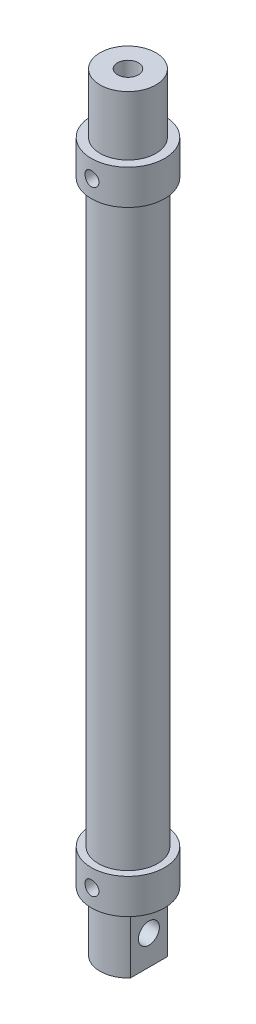
ISO-10303-21;
HEADER;
FILE_DESCRIPTION(('STEP AP214'),'2;1');
FILE_NAME('part.step','',(''),(''),'','','');
FILE_SCHEMA(('AUTOMOTIVE_DESIGN { 1 0 10303 214 1 1 1 1 }'));
ENDSEC;
DATA;
#1=APPLICATION_CONTEXT('core data for automotive mechanical design processes');
#2=APPLICATION_PROTOCOL_DEFINITION('international standard','automotive_design',2000,#1);
#3=PRODUCT_CONTEXT('',#1,'mechanical');
#4=PRODUCT('Part','Part','',(#3));
#5=PRODUCT_RELATED_PRODUCT_CATEGORY('part','',(#4));
#6=PRODUCT_DEFINITION_FORMATION('','',#4);
#7=PRODUCT_DEFINITION_CONTEXT('part definition',#1,'design');
#8=PRODUCT_DEFINITION('design','',#6,#7);
#9=PRODUCT_DEFINITION_SHAPE('','',#8);
#10=(LENGTH_UNIT() NAMED_UNIT(*) SI_UNIT(.MILLI.,.METRE.));
#11=(NAMED_UNIT(*) PLANE_ANGLE_UNIT() SI_UNIT($,.RADIAN.));
#12=(NAMED_UNIT(*) SI_UNIT($,.STERADIAN.) SOLID_ANGLE_UNIT());
#13=UNCERTAINTY_MEASURE_WITH_UNIT(LENGTH_MEASURE(1.E-05),#10,'distance_accuracy_value','');
#14=(GEOMETRIC_REPRESENTATION_CONTEXT(3) GLOBAL_UNCERTAINTY_ASSIGNED_CONTEXT((#13)) GLOBAL_UNIT_ASSIGNED_CONTEXT((#10,
#11,#12)) REPRESENTATION_CONTEXT('',''));
#15=CARTESIAN_POINT('',(0.,0.,0.));
#16=DIRECTION('',(0.,0.,1.));
#17=DIRECTION('',(1.,0.,0.));
#18=AXIS2_PLACEMENT_3D('',#15,#16,#17);
#19=CARTESIAN_POINT('',(0.,220.,0.));
#20=DIRECTION('',(0.,-1.,0.));
#21=DIRECTION('',(0.,0.,-1.));
#22=AXIS2_PLACEMENT_3D('',#19,#20,#21);
#23=CYLINDRICAL_SURFACE('',#22,8.);
#24=CARTESIAN_POINT('',(0.,220.,0.));
#25=DIRECTION('',(0.,1.,0.));
#26=DIRECTION('',(0.,0.,1.));
#27=AXIS2_PLACEMENT_3D('',#24,#25,#26);
#28=CIRCLE('',#27,8.);
#29=CARTESIAN_POINT('',(0.,220.,8.));
#30=VERTEX_POINT('',#29);
#31=EDGE_CURVE('E11',#30,#30,#28,.T.);
#32=ORIENTED_EDGE('',*,*,#31,.F.);
#33=EDGE_LOOP('',(#32));
#34=FACE_BOUND('',#33,.T.);
#35=CARTESIAN_POINT('',(0.,203.,0.));
#36=DIRECTION('',(0.,1.,0.));
#37=DIRECTION('',(0.,0.,1.));
#38=AXIS2_PLACEMENT_3D('',#35,#36,#37);
#39=CIRCLE('',#38,8.);
#40=CARTESIAN_POINT('',(0.,203.,8.));
#41=VERTEX_POINT('',#40);
#42=EDGE_CURVE('E52',#41,#41,#39,.T.);
#43=ORIENTED_EDGE('',*,*,#42,.T.);
#44=EDGE_LOOP('',(#43));
#45=FACE_BOUND('',#44,.T.);
#46=ADVANCED_FACE('F45',(#34,#45),#23,.T.);
#47=CARTESIAN_POINT('',(0.,220.,0.));
#48=DIRECTION('',(0.,1.,0.));
#49=DIRECTION('',(0.,0.,1.));
#50=AXIS2_PLACEMENT_3D('',#47,#48,#49);
#51=PLANE('',#50);
#52=CARTESIAN_POINT('',(0.,220.,0.));
#53=DIRECTION('',(0.,1.,0.));
#54=DIRECTION('',(0.,0.,1.));
#55=AXIS2_PLACEMENT_3D('',#52,#53,#54);
#56=CIRCLE('',#55,3.);
#57=CARTESIAN_POINT('',(0.,220.,3.));
#58=VERTEX_POINT('',#57);
#59=EDGE_CURVE('E58',#58,#58,#56,.T.);
#60=ORIENTED_EDGE('',*,*,#59,.F.);
#61=EDGE_LOOP('',(#60));
#62=FACE_BOUND('',#61,.T.);
#63=ORIENTED_EDGE('',*,*,#31,.T.);
#64=EDGE_LOOP('',(#63));
#65=FACE_BOUND('',#64,.T.);
#66=ADVANCED_FACE('F74',(#62,#65),#51,.T.);
#67=CARTESIAN_POINT('',(0.,203.,0.));
#68=DIRECTION('',(0.,1.,0.));
#69=DIRECTION('',(0.,0.,1.));
#70=AXIS2_PLACEMENT_3D('',#67,#68,#69);
#71=PLANE('',#70);
#72=CARTESIAN_POINT('',(0.,203.,0.));
#73=DIRECTION('',(0.,1.,0.));
#74=DIRECTION('',(0.,0.,1.));
#75=AXIS2_PLACEMENT_3D('',#72,#73,#74);
#76=CIRCLE('',#75,3.);
#77=CARTESIAN_POINT('',(0.,203.,3.));
#78=VERTEX_POINT('',#77);
#79=EDGE_CURVE('E48',#78,#78,#76,.T.);
#80=ORIENTED_EDGE('',*,*,#79,.T.);
#81=EDGE_LOOP('',(#80));
#82=FACE_BOUND('',#81,.T.);
#83=ORIENTED_EDGE('',*,*,#42,.F.);
#84=EDGE_LOOP('',(#83));
#85=FACE_BOUND('',#84,.T.);
#86=ADVANCED_FACE('F65',(#82,#85),#71,.F.);
#87=CARTESIAN_POINT('',(0.,94.,0.));
#88=DIRECTION('',(0.,1.,0.));
#89=DIRECTION('',(0.,0.,1.));
#90=AXIS2_PLACEMENT_3D('',#87,#88,#89);
#91=CYLINDRICAL_SURFACE('',#90,3.);
#92=ORIENTED_EDGE('',*,*,#59,.T.);
#93=EDGE_LOOP('',(#92));
#94=FACE_BOUND('',#93,.T.);
#95=ORIENTED_EDGE('',*,*,#79,.F.);
#96=EDGE_LOOP('',(#95));
#97=FACE_BOUND('',#96,.T.);
#98=ADVANCED_FACE('F68',(#94,#97),#91,.F.);
#99=CLOSED_SHELL('',(#46,#66,#86,#98));
#100=MANIFOLD_SOLID_BREP('B2',#99);
#101=CARTESIAN_POINT('',(0.,203.,0.));
#102=DIRECTION('',(0.,-1.,0.));
#103=DIRECTION('',(0.,0.,-1.));
#104=AXIS2_PLACEMENT_3D('',#101,#102,#103);
#105=CYLINDRICAL_SURFACE('',#104,10.5);
#106=CARTESIAN_POINT('',(0.,203.,0.));
#107=DIRECTION('',(0.,1.,0.));
#108=DIRECTION('',(0.,0.,1.));
#109=AXIS2_PLACEMENT_3D('',#106,#107,#108);
#110=CIRCLE('',#109,10.5);
#111=CARTESIAN_POINT('',(0.,203.,10.5));
#112=VERTEX_POINT('',#111);
#113=EDGE_CURVE('E44',#112,#112,#110,.T.);
#114=ORIENTED_EDGE('',*,*,#113,.F.);
#115=EDGE_LOOP('',(#114));
#116=FACE_BOUND('',#115,.T.);
#117=CARTESIAN_POINT('',(0.,193.,0.));
#118=DIRECTION('',(0.,1.,0.));
#119=DIRECTION('',(0.,0.,1.));
#120=AXIS2_PLACEMENT_3D('',#117,#118,#119);
#121=CIRCLE('',#120,10.5);
#122=CARTESIAN_POINT('',(0.,193.,10.5));
#123=VERTEX_POINT('',#122);
#124=EDGE_CURVE('E127',#123,#123,#121,.T.);
#125=ORIENTED_EDGE('',*,*,#124,.T.);
#126=EDGE_LOOP('',(#125));
#127=FACE_BOUND('',#126,.T.);
#128=CARTESIAN_POINT('',(-2.,198.,10.3077640640442));
#129=CARTESIAN_POINT('',(-1.99999576747856,197.888757965715,10.3077662331161));
#130=CARTESIAN_POINT('',(-1.99068741084944,197.777461397596,10.3095844213753));
#131=CARTESIAN_POINT('',(-1.95372640408913,197.558008931146,10.3166512903101));
#132=CARTESIAN_POINT('',(-1.92605839800911,197.449855741032,10.3219028425853));
#133=CARTESIAN_POINT('',(-1.85326060026377,197.239896982716,10.3352205759115));
#134=CARTESIAN_POINT('',(-1.80814733034197,197.138085514121,10.3432840931504));
#135=CARTESIAN_POINT('',(-1.70178371624362,196.943481779794,10.3613140447469));
#136=CARTESIAN_POINT('',(-1.64053454751282,196.850688857764,10.3712803404791));
#137=CARTESIAN_POINT('',(-1.50279954107445,196.675558444085,10.3921358315924));
#138=CARTESIAN_POINT('',(-1.42614646664806,196.593353566668,10.4030343280567));
#139=CARTESIAN_POINT('',(-1.26014096103138,196.442888707737,10.4244441525531));
#140=CARTESIAN_POINT('',(-1.17078768389029,196.374629655882,10.4349554547355));
#141=CARTESIAN_POINT('',(-0.981045466793095,196.253484397504,10.4545063484475));
#142=CARTESIAN_POINT('',(-0.880575179073281,196.200723456598,10.4635337012442));
#143=CARTESIAN_POINT('',(-0.671995748816191,196.112879452154,10.4789953609074));
#144=CARTESIAN_POINT('',(-0.563887255355314,196.077794888575,10.4854298877952));
#145=CARTESIAN_POINT('',(-0.344474928084999,196.026710279054,10.4949152003273));
#146=CARTESIAN_POINT('',(-0.233224906241214,196.010486585448,10.4980056086445));
#147=CARTESIAN_POINT('',(-0.00954197299762268,195.996887180764,10.5005911121681));
#148=CARTESIAN_POINT('',(0.102890833726011,195.999509815571,10.5000865229021));
#149=CARTESIAN_POINT('',(0.324213319087042,196.023357538852,10.4955697879858));
#150=CARTESIAN_POINT('',(0.433130008737623,196.044341793068,10.4916030541438));
#151=CARTESIAN_POINT('',(0.645867459868364,196.103935934641,10.4806587329107));
#152=CARTESIAN_POINT('',(0.749688031123391,196.142546479389,10.4736810332228));
#153=CARTESIAN_POINT('',(0.949982043237772,196.236525178388,10.4574231445239));
#154=CARTESIAN_POINT('',(1.04640941469807,196.291989158331,10.4481298452825));
#155=CARTESIAN_POINT('',(1.22867819746183,196.418029632365,10.4282677453701));
#156=CARTESIAN_POINT('',(1.31451849765684,196.48860771055,10.4176988110517));
#157=CARTESIAN_POINT('',(1.47460391847544,196.644198683397,10.3962580003512));
#158=CARTESIAN_POINT('',(1.548644094618,196.729422294666,10.385383976594));
#159=CARTESIAN_POINT('',(1.68141214001886,196.911184410209,10.3647181130096));
#160=CARTESIAN_POINT('',(1.74013977079182,197.007723090675,10.3549262900386));
#161=CARTESIAN_POINT('',(1.84067693368896,197.209651945166,10.3375301079842));
#162=CARTESIAN_POINT('',(1.88245589383698,197.315057703903,10.3299297088641));
#163=CARTESIAN_POINT('',(1.94765282338577,197.531570190026,10.3178369316443));
#164=CARTESIAN_POINT('',(1.97107294526376,197.642676247452,10.3133441891954));
#165=CARTESIAN_POINT('',(1.9985865151718,197.86558516725,10.3080477071057));
#166=CARTESIAN_POINT('',(2.0029747581422,197.977350344609,10.3071877035286));
#167=CARTESIAN_POINT('',(1.99309094275412,198.200016265089,10.3091034020993));
#168=CARTESIAN_POINT('',(1.97881983846034,198.310917052117,10.3118789183607));
#169=CARTESIAN_POINT('',(1.93227575814481,198.527731922876,10.3207004508845));
#170=CARTESIAN_POINT('',(1.90015801454271,198.633680582036,10.3267182518009));
#171=CARTESIAN_POINT('',(1.81899736459844,198.838692762659,10.3413218894342));
#172=CARTESIAN_POINT('',(1.76995317622344,198.93775576191,10.349907920666));
#173=CARTESIAN_POINT('',(1.65565593283059,199.127481258731,10.3688083137884));
#174=CARTESIAN_POINT('',(1.59021706249931,199.218029851452,10.3791420142757));
#175=CARTESIAN_POINT('',(1.44523791801399,199.386967857122,10.4003193132972));
#176=CARTESIAN_POINT('',(1.36569633350554,199.465356138926,10.4111629591442));
#177=CARTESIAN_POINT('',(1.19345143615016,199.608853516365,10.4323195643359));
#178=CARTESIAN_POINT('',(1.10058140595695,199.673764102217,10.4426231174714));
#179=CARTESIAN_POINT('',(0.905083177029172,199.787060883346,10.4613791209831));
#180=CARTESIAN_POINT('',(0.80245536248802,199.835447728867,10.4698316441966));
#181=CARTESIAN_POINT('',(0.590897063083826,199.914028154784,10.4838928326543));
#182=CARTESIAN_POINT('',(0.482003476197483,199.944318260011,10.4895165603032));
#183=CARTESIAN_POINT('',(0.260557092128003,199.986152933502,10.4973508525688));
#184=CARTESIAN_POINT('',(0.1480046942225,199.997699540242,10.4995617883475));
#185=CARTESIAN_POINT('',(-0.075662434707431,200.001646620402,10.5003136791865));
#186=CARTESIAN_POINT('',(-0.186771797894084,199.994346590725,10.4989120431795));
#187=CARTESIAN_POINT('',(-0.406149933837082,199.961464807718,10.4927159027535));
#188=CARTESIAN_POINT('',(-0.514418735713435,199.935883241875,10.4879214331301));
#189=CARTESIAN_POINT('',(-0.724877493923957,199.867292390599,10.4754786931883));
#190=CARTESIAN_POINT('',(-0.827078490952685,199.824315944648,10.467835802495));
#191=CARTESIAN_POINT('',(-1.02286315652585,199.722191619318,10.4505225438582));
#192=CARTESIAN_POINT('',(-1.11644622254048,199.663042610369,10.4408520343067));
#193=CARTESIAN_POINT('',(-1.29382831156942,199.529226067606,10.4203698549555));
#194=CARTESIAN_POINT('',(-1.3774627863143,199.4543426431,10.4095434656168));
#195=CARTESIAN_POINT('',(-1.53108232354618,199.291629924921,10.3880613328083));
#196=CARTESIAN_POINT('',(-1.6010641667755,199.203797586476,10.3774056301285));
#197=CARTESIAN_POINT('',(-1.72602479696763,199.01667088302,10.3573593703099));
#198=CARTESIAN_POINT('',(-1.78085311729889,198.917274584498,10.3479819394977));
#199=CARTESIAN_POINT('',(-1.87294496084188,198.710533647281,10.3317124385101));
#200=CARTESIAN_POINT('',(-1.91022491447504,198.603196552924,10.3248180449097));
#201=CARTESIAN_POINT('',(-1.95866569612498,198.412966141594,10.3157185929825));
#202=CARTESIAN_POINT('',(-1.97413922525693,198.331180099667,10.312753537306));
#203=CARTESIAN_POINT('',(-1.99480781101632,198.16627283608,10.3087754902806));
#204=CARTESIAN_POINT('',(-2.00000316374252,198.083151652952,10.3077624426974));
#205=CARTESIAN_POINT('',(-2.,198.,10.3077640640442));
#206=B_SPLINE_CURVE_WITH_KNOTS('',3,(#128,#129,#130,#131,#132,#133,#134,#135,#136,#137,#138,
#139,#140,#141,#142,#143,#144,#145,#146,#147,#148,#149,#150,#151,#152,#153,#154,#155,#156,#157,
#158,#159,#160,#161,#162,#163,#164,#165,#166,#167,#168,#169,#170,#171,#172,#173,#174,#175,#176,
#177,#178,#179,#180,#181,#182,#183,#184,#185,#186,#187,#188,#189,#190,#191,#192,#193,#194,#195,
#196,#197,#198,#199,#200,#201,#202,#203,#204,#205),.UNSPECIFIED.,.T.,.F.,(4,2,2,2,2,2,2,2,2,2,2,
2,2,2,2,2,2,2,2,2,2,2,2,2,2,2,2,2,2,2,2,2,2,2,2,2,2,2,4),(0.,0.333421770793022,
0.667122766528012,1.00050849774322,1.33386994964594,1.67106783624807,2.00828819387893,
2.34816357408135,2.68801010714636,3.02378433813051,3.35952909906649,3.69093508873408,
4.02235343955144,4.35569260286979,4.68906672027079,5.02771540514515,5.36636936399093,
5.70563149865266,6.04485385066211,6.37880260457196,6.71273428413008,7.04380584853122,
7.37490249426554,7.70993643750709,8.04500152677398,8.38469764647552,8.72438039685045,
9.06223477768129,9.40005241219934,9.73253485751047,10.0650138930459,10.3968681534587,
10.7287455981505,11.0655148874687,11.4023634904492,11.7424455878908,12.0822086321944,
12.3314432878497,12.580670763326),.UNSPECIFIED.);
#207=CARTESIAN_POINT('',(-2.,198.,10.3077640640442));
#208=VERTEX_POINT('',#207);
#209=EDGE_CURVE('E138',#208,#208,#206,.T.);
#210=ORIENTED_EDGE('',*,*,#209,.F.);
#211=EDGE_LOOP('',(#210));
#212=FACE_BOUND('',#211,.T.);
#213=ADVANCED_FACE('F114',(#116,#127,#212),#105,.T.);
#214=CARTESIAN_POINT('',(0.,94.,0.));
#215=DIRECTION('',(0.,1.,0.));
#216=DIRECTION('',(0.,0.,1.));
#217=AXIS2_PLACEMENT_3D('',#214,#215,#216);
#218=CYLINDRICAL_SURFACE('',#217,3.);
#219=CARTESIAN_POINT('',(0.,203.,0.));
#220=DIRECTION('',(0.,1.,0.));
#221=DIRECTION('',(0.,0.,1.));
#222=AXIS2_PLACEMENT_3D('',#219,#220,#221);
#223=CIRCLE('',#222,3.);
#224=CARTESIAN_POINT('',(0.,203.,3.));
#225=VERTEX_POINT('',#224);
#226=EDGE_CURVE('E132',#225,#225,#223,.T.);
#227=ORIENTED_EDGE('',*,*,#226,.T.);
#228=EDGE_LOOP('',(#227));
#229=FACE_BOUND('',#228,.T.);
#230=CARTESIAN_POINT('',(0.,193.,0.));
#231=DIRECTION('',(0.,1.,0.));
#232=DIRECTION('',(0.,0.,1.));
#233=AXIS2_PLACEMENT_3D('',#230,#231,#232);
#234=CIRCLE('',#233,3.);
#235=CARTESIAN_POINT('',(0.,193.,3.));
#236=VERTEX_POINT('',#235);
#237=EDGE_CURVE('E136',#236,#236,#234,.T.);
#238=ORIENTED_EDGE('',*,*,#237,.F.);
#239=EDGE_LOOP('',(#238));
#240=FACE_BOUND('',#239,.T.);
#241=CARTESIAN_POINT('',(0.,196.,3.));
#242=CARTESIAN_POINT('',(-0.100484716668078,195.999999450368,3.0000004164484));
#243=CARTESIAN_POINT('',(-0.200969087132901,196.007613969956,2.99490802753388));
#244=CARTESIAN_POINT('',(-0.398733058031679,196.037596864106,2.97504652423809));
#245=CARTESIAN_POINT('',(-0.496011113955005,196.059972243123,2.96027281581235));
#246=CARTESIAN_POINT('',(-0.68421230785425,196.118107717325,2.92250482404708));
#247=CARTESIAN_POINT('',(-0.775162872657558,196.153805140008,2.89954905493315));
#248=CARTESIAN_POINT('',(-0.949415290997261,196.237063363272,2.8472613787744));
#249=CARTESIAN_POINT('',(-1.03271603160966,196.284625886301,2.8179285460551));
#250=CARTESIAN_POINT('',(-1.1972847007701,196.394656937367,2.75227329369839));
#251=CARTESIAN_POINT('',(-1.27778030546067,196.458047860743,2.7155689757932));
#252=CARTESIAN_POINT('',(-1.42772804469273,196.595730048658,2.63982313083466));
#253=CARTESIAN_POINT('',(-1.49716405543887,196.670036929838,2.60077830356833));
#254=CARTESIAN_POINT('',(-1.63422297745495,196.841052367613,2.51728264678794));
#255=CARTESIAN_POINT('',(-1.6998318636275,196.939445653203,2.47295067937795));
#256=CARTESIAN_POINT('',(-1.81350357014175,197.148363377647,2.3908414735282));
#257=CARTESIAN_POINT('',(-1.86159673426503,197.258866401563,2.35305295954668));
#258=CARTESIAN_POINT('',(-1.92674035011438,197.456711293422,2.2997626664146));
#259=CARTESIAN_POINT('',(-1.94874447236008,197.541528452874,2.28097627892403));
#260=CARTESIAN_POINT('',(-1.98150617785229,197.714744504742,2.25257969659604));
#261=CARTESIAN_POINT('',(-1.99228314651963,197.803136948726,2.24295368744147));
#262=CARTESIAN_POINT('',(-2.00191364141227,197.981474778856,2.23436605608045));
#263=CARTESIAN_POINT('',(-2.00071842917523,198.071425023452,2.23544802558503));
#264=CARTESIAN_POINT('',(-1.98637581333355,198.2496349735,2.24819775483426));
#265=CARTESIAN_POINT('',(-1.97321828380392,198.337893182028,2.25987448286882));
#266=CARTESIAN_POINT('',(-1.93664994217324,198.506467051242,2.29127185989961));
#267=CARTESIAN_POINT('',(-1.91371711479475,198.586961335939,2.31061488324376));
#268=CARTESIAN_POINT('',(-1.85870118583422,198.743023690976,2.35509622933625));
#269=CARTESIAN_POINT('',(-1.82661507328549,198.818590130239,2.38023645854891));
#270=CARTESIAN_POINT('',(-1.74673818732646,198.979025395357,2.43964196377949));
#271=CARTESIAN_POINT('',(-1.69708052300442,199.062659900483,2.47472317740629));
#272=CARTESIAN_POINT('',(-1.58668960438217,199.221383395286,2.5469153773344));
#273=CARTESIAN_POINT('',(-1.5259426899961,199.296461657762,2.5840288270933));
#274=CARTESIAN_POINT('',(-1.37981165322305,199.452542545603,2.66543343763726));
#275=CARTESIAN_POINT('',(-1.29193938283652,199.531334048683,2.70954744720562));
#276=CARTESIAN_POINT('',(-1.10200799908003,199.673196494539,2.79218100665214));
#277=CARTESIAN_POINT('',(-0.99996229934364,199.736282145409,2.83070577648044));
#278=CARTESIAN_POINT('',(-0.804857827096472,199.833477718623,2.89145404090366));
#279=CARTESIAN_POINT('',(-0.713957643371856,199.870843363339,2.91539261165541));
#280=CARTESIAN_POINT('',(-0.526036043935431,199.932104925625,2.95507719030499));
#281=CARTESIAN_POINT('',(-0.429019879001602,199.956012227132,2.97083012127544));
#282=CARTESIAN_POINT('',(-0.230985453172235,199.989161165238,2.99275882156808));
#283=CARTESIAN_POINT('',(-0.129951811934114,199.998339460938,2.99889322461187));
#284=CARTESIAN_POINT('',(0.0724415193893884,200.001247088562,3.00083114965147));
#285=CARTESIAN_POINT('',(0.173801186186666,199.994977500489,2.99663539385634));
#286=CARTESIAN_POINT('',(0.366455717204277,199.968375944438,2.97899589424272));
#287=CARTESIAN_POINT('',(0.457957444679229,199.949062702245,2.96622246390225));
#288=CARTESIAN_POINT('',(0.636116392427435,199.898404313987,2.93318449284836));
#289=CARTESIAN_POINT('',(0.722772837571169,199.867057249072,2.91291875746988));
#290=CARTESIAN_POINT('',(0.89466475046603,199.791347702955,2.86496352529157));
#291=CARTESIAN_POINT('',(0.979496184631449,199.746311845918,2.83689870135784));
#292=CARTESIAN_POINT('',(1.14068302395732,199.645566710054,2.7760185561151));
#293=CARTESIAN_POINT('',(1.21703314820093,199.589850839468,2.7432003040394));
#294=CARTESIAN_POINT('',(1.37185445482327,199.459392131842,2.66954546653429));
#295=CARTESIAN_POINT('',(1.44875187569568,199.383033739925,2.62826156800163));
#296=CARTESIAN_POINT('',(1.58933968069452,199.218888570043,2.54571173085955));
#297=CARTESIAN_POINT('',(1.65302093657233,199.131093960892,2.50444582417843));
#298=CARTESIAN_POINT('',(1.76124776549316,198.952857587232,2.42939678970577));
#299=CARTESIAN_POINT('',(1.80695636125286,198.863267966538,2.39527597025699));
#300=CARTESIAN_POINT('',(1.88496213740267,198.676127347556,2.33438974266152));
#301=CARTESIAN_POINT('',(1.91728345682192,198.578591061695,2.3076111252982));
#302=CARTESIAN_POINT('',(1.96235843465341,198.395435512805,2.26933208182631));
#303=CARTESIAN_POINT('',(1.97758597566227,198.310828190124,2.25594998021256));
#304=CARTESIAN_POINT('',(1.99699205923373,198.139426718682,2.23879466438397));
#305=CARTESIAN_POINT('',(2.00118260285317,198.05263504886,2.23501101347816));
#306=CARTESIAN_POINT('',(1.99823921981266,197.879356943276,2.23764201149982));
#307=CARTESIAN_POINT('',(1.99109858767783,197.792870718626,2.24406269907464));
#308=CARTESIAN_POINT('',(1.96596997224745,197.622656471468,2.26610452403492));
#309=CARTESIAN_POINT('',(1.94796751728257,197.538932286176,2.28173793527616));
#310=CARTESIAN_POINT('',(1.89593035657493,197.354288813519,2.32526843904802));
#311=CARTESIAN_POINT('',(1.85890187130763,197.254732287057,2.35532333574984));
#312=CARTESIAN_POINT('',(1.77084526236219,197.064513165616,2.4222216112131));
#313=CARTESIAN_POINT('',(1.71979748341258,196.973863302008,2.459074496867));
#314=CARTESIAN_POINT('',(1.60398280555152,196.800718112864,2.5361718657712));
#315=CARTESIAN_POINT('',(1.5389830989402,196.718401254577,2.57646587392281));
#316=CARTESIAN_POINT('',(1.39671768031092,196.564677521742,2.65628301537845));
#317=CARTESIAN_POINT('',(1.31944821025745,196.493274002971,2.69580590832398));
#318=CARTESIAN_POINT('',(1.14145732976969,196.353287895691,2.77631551964084));
#319=CARTESIAN_POINT('',(1.0389616695557,196.286581359822,2.81669805449993));
#320=CARTESIAN_POINT('',(0.820868555771161,196.172086723335,2.88777665874163));
#321=CARTESIAN_POINT('',(0.705292062449097,196.124268893176,2.91848793445257));
#322=CARTESIAN_POINT('',(0.491435069835694,196.058845421836,2.96101644836896));
#323=CARTESIAN_POINT('',(0.395012325257881,196.036888960901,2.97551480368935));
#324=CARTESIAN_POINT('',(0.199058012023926,196.007471967462,2.99500280141853));
#325=CARTESIAN_POINT('',(0.0995288361879977,196.000000544404,2.99999958751315));
#326=CARTESIAN_POINT('',(0.,196.,3.));
#327=B_SPLINE_CURVE_WITH_KNOTS('',3,(#241,#242,#243,#244,#245,#246,#247,#248,#249,#250,#251,
#252,#253,#254,#255,#256,#257,#258,#259,#260,#261,#262,#263,#264,#265,#266,#267,#268,#269,#270,
#271,#272,#273,#274,#275,#276,#277,#278,#279,#280,#281,#282,#283,#284,#285,#286,#287,#288,#289,
#290,#291,#292,#293,#294,#295,#296,#297,#298,#299,#300,#301,#302,#303,#304,#305,#306,#307,#308,
#309,#310,#311,#312,#313,#314,#315,#316,#317,#318,#319,#320,#321,#322,#323,#324,#325,#326),
.UNSPECIFIED.,.T.,.F.,(4,2,2,2,2,2,2,2,2,2,2,2,2,2,2,2,2,2,2,2,2,2,2,2,2,2,2,2,2,2,2,2,2,2,2,2,
2,2,2,2,2,2,4),(0.,0.3010532265054,0.602249414348685,0.902046153190231,1.20188643867386,
1.52717029000557,1.85292411604317,2.23006683295981,2.60655305445439,2.87433693676029,
3.14165767845811,3.41006711735383,3.67870397263357,3.93548862198027,4.19235783805082,
4.50147574660881,4.81097703780063,5.18718954496758,5.56304840301369,5.86524087696764,
6.16717735142818,6.47040883294255,6.77361911533419,7.05553084792476,7.33748755138274,
7.63652346829519,7.93574454945207,8.28228176141297,8.62905753175764,8.94649935304483,
9.2633662664073,9.52324048016143,9.78283200333097,10.0425772028455,10.302669238524,
10.632066087042,10.9619271337796,11.2977924520448,11.6337608397016,12.0179535155883,
12.4015390656083,12.6999529136675,12.9981423125957),.UNSPECIFIED.);
#328=CARTESIAN_POINT('',(0.,196.,3.));
#329=VERTEX_POINT('',#328);
#330=EDGE_CURVE('E118',#329,#329,#327,.T.);
#331=ORIENTED_EDGE('',*,*,#330,.F.);
#332=EDGE_LOOP('',(#331));
#333=FACE_BOUND('',#332,.T.);
#334=ADVANCED_FACE('F154',(#229,#240,#333),#218,.F.);
#335=CARTESIAN_POINT('',(0.,203.,0.));
#336=DIRECTION('',(0.,1.,0.));
#337=DIRECTION('',(0.,0.,1.));
#338=AXIS2_PLACEMENT_3D('',#335,#336,#337);
#339=PLANE('',#338);
#340=ORIENTED_EDGE('',*,*,#226,.F.);
#341=EDGE_LOOP('',(#340));
#342=FACE_BOUND('',#341,.T.);
#343=ORIENTED_EDGE('',*,*,#113,.T.);
#344=EDGE_LOOP('',(#343));
#345=FACE_BOUND('',#344,.T.);
#346=ADVANCED_FACE('F159',(#342,#345),#339,.T.);
#347=CARTESIAN_POINT('',(0.,193.,0.));
#348=DIRECTION('',(0.,1.,0.));
#349=DIRECTION('',(0.,0.,1.));
#350=AXIS2_PLACEMENT_3D('',#347,#348,#349);
#351=PLANE('',#350);
#352=ORIENTED_EDGE('',*,*,#237,.T.);
#353=EDGE_LOOP('',(#352));
#354=FACE_BOUND('',#353,.T.);
#355=ORIENTED_EDGE('',*,*,#124,.F.);
#356=EDGE_LOOP('',(#355));
#357=FACE_BOUND('',#356,.T.);
#358=ADVANCED_FACE('F152',(#354,#357),#351,.F.);
#359=CARTESIAN_POINT('',(0.,198.,11.));
#360=DIRECTION('',(0.,0.,-1.));
#361=DIRECTION('',(-1.,0.,0.));
#362=AXIS2_PLACEMENT_3D('',#359,#360,#361);
#363=CYLINDRICAL_SURFACE('',#362,2.);
#364=ORIENTED_EDGE('',*,*,#330,.T.);
#365=EDGE_LOOP('',(#364));
#366=FACE_BOUND('',#365,.T.);
#367=ORIENTED_EDGE('',*,*,#209,.T.);
#368=EDGE_LOOP('',(#367));
#369=FACE_BOUND('',#368,.T.);
#370=ADVANCED_FACE('F149',(#366,#369),#363,.F.);
#371=CLOSED_SHELL('',(#213,#334,#346,#358,#370));
#372=MANIFOLD_SOLID_BREP('B6',#371);
#373=CARTESIAN_POINT('',(0.,193.,0.));
#374=DIRECTION('',(0.,-1.,0.));
#375=DIRECTION('',(0.,0.,-1.));
#376=AXIS2_PLACEMENT_3D('',#373,#374,#375);
#377=CYLINDRICAL_SURFACE('',#376,8.5);
#378=CARTESIAN_POINT('',(0.,193.,0.));
#379=DIRECTION('',(0.,1.,0.));
#380=DIRECTION('',(0.,0.,1.));
#381=AXIS2_PLACEMENT_3D('',#378,#379,#380);
#382=CIRCLE('',#381,8.5);
#383=CARTESIAN_POINT('',(0.,193.,8.5));
#384=VERTEX_POINT('',#383);
#385=EDGE_CURVE('E113',#384,#384,#382,.T.);
#386=ORIENTED_EDGE('',*,*,#385,.F.);
#387=EDGE_LOOP('',(#386));
#388=FACE_BOUND('',#387,.T.);
#389=CARTESIAN_POINT('',(0.,27.,0.));
#390=DIRECTION('',(0.,1.,0.));
#391=DIRECTION('',(0.,0.,1.));
#392=AXIS2_PLACEMENT_3D('',#389,#390,#391);
#393=CIRCLE('',#392,8.5);
#394=CARTESIAN_POINT('',(0.,27.,8.5));
#395=VERTEX_POINT('',#394);
#396=EDGE_CURVE('E222',#395,#395,#393,.T.);
#397=ORIENTED_EDGE('',*,*,#396,.T.);
#398=EDGE_LOOP('',(#397));
#399=FACE_BOUND('',#398,.T.);
#400=ADVANCED_FACE('F214',(#388,#399),#377,.T.);
#401=CARTESIAN_POINT('',(0.,193.,0.));
#402=DIRECTION('',(0.,1.,0.));
#403=DIRECTION('',(0.,0.,1.));
#404=AXIS2_PLACEMENT_3D('',#401,#402,#403);
#405=PLANE('',#404);
#406=CARTESIAN_POINT('',(0.,193.,0.));
#407=DIRECTION('',(0.,1.,0.));
#408=DIRECTION('',(0.,0.,1.));
#409=AXIS2_PLACEMENT_3D('',#406,#407,#408);
#410=CIRCLE('',#409,3.);
#411=CARTESIAN_POINT('',(0.,193.,3.));
#412=VERTEX_POINT('',#411);
#413=EDGE_CURVE('E217',#412,#412,#410,.T.);
#414=ORIENTED_EDGE('',*,*,#413,.F.);
#415=EDGE_LOOP('',(#414));
#416=FACE_BOUND('',#415,.T.);
#417=ORIENTED_EDGE('',*,*,#385,.T.);
#418=EDGE_LOOP('',(#417));
#419=FACE_BOUND('',#418,.T.);
#420=ADVANCED_FACE('F241',(#416,#419),#405,.T.);
#421=CARTESIAN_POINT('',(0.,27.,0.));
#422=DIRECTION('',(0.,1.,0.));
#423=DIRECTION('',(0.,0.,1.));
#424=AXIS2_PLACEMENT_3D('',#421,#422,#423);
#425=PLANE('',#424);
#426=ORIENTED_EDGE('',*,*,#396,.F.);
#427=EDGE_LOOP('',(#426));
#428=FACE_BOUND('',#427,.T.);
#429=ADVANCED_FACE('F243',(#428),#425,.F.);
#430=CARTESIAN_POINT('',(0.,94.,0.));
#431=DIRECTION('',(0.,1.,0.));
#432=DIRECTION('',(0.,0.,1.));
#433=AXIS2_PLACEMENT_3D('',#430,#431,#432);
#434=CYLINDRICAL_SURFACE('',#433,3.);
#435=ORIENTED_EDGE('',*,*,#413,.T.);
#436=EDGE_LOOP('',(#435));
#437=FACE_BOUND('',#436,.T.);
#438=CARTESIAN_POINT('',(0.,94.,0.));
#439=DIRECTION('',(0.,1.,0.));
#440=DIRECTION('',(0.,0.,1.));
#441=AXIS2_PLACEMENT_3D('',#438,#439,#440);
#442=CIRCLE('',#441,3.);
#443=CARTESIAN_POINT('',(0.,94.,3.));
#444=VERTEX_POINT('',#443);
#445=EDGE_CURVE('E229',#444,#444,#442,.T.);
#446=ORIENTED_EDGE('',*,*,#445,.F.);
#447=EDGE_LOOP('',(#446));
#448=FACE_BOUND('',#447,.T.);
#449=ADVANCED_FACE('F238',(#437,#448),#434,.F.);
#450=CARTESIAN_POINT('',(0.,94.,0.));
#451=DIRECTION('',(0.,1.,0.));
#452=DIRECTION('',(0.,0.,1.));
#453=AXIS2_PLACEMENT_3D('',#450,#451,#452);
#454=PLANE('',#453);
#455=ORIENTED_EDGE('',*,*,#445,.T.);
#456=EDGE_LOOP('',(#455));
#457=FACE_BOUND('',#456,.T.);
#458=ADVANCED_FACE('F254',(#457),#454,.T.);
#459=CLOSED_SHELL('',(#400,#420,#429,#449,#458));
#460=MANIFOLD_SOLID_BREP('B39',#459);
#461=CARTESIAN_POINT('',(0.,27.,0.));
#462=DIRECTION('',(0.,-1.,0.));
#463=DIRECTION('',(0.,0.,-1.));
#464=AXIS2_PLACEMENT_3D('',#461,#462,#463);
#465=CYLINDRICAL_SURFACE('',#464,10.5);
#466=CARTESIAN_POINT('',(0.,27.,0.));
#467=DIRECTION('',(0.,1.,0.));
#468=DIRECTION('',(0.,0.,1.));
#469=AXIS2_PLACEMENT_3D('',#466,#467,#468);
#470=CIRCLE('',#469,10.5);
#471=CARTESIAN_POINT('',(0.,27.,10.5));
#472=VERTEX_POINT('',#471);
#473=EDGE_CURVE('E213',#472,#472,#470,.T.);
#474=ORIENTED_EDGE('',*,*,#473,.F.);
#475=EDGE_LOOP('',(#474));
#476=FACE_BOUND('',#475,.T.);
#477=CARTESIAN_POINT('',(0.,17.,0.));
#478=DIRECTION('',(0.,1.,0.));
#479=DIRECTION('',(0.,0.,1.));
#480=AXIS2_PLACEMENT_3D('',#477,#478,#479);
#481=CIRCLE('',#480,10.5);
#482=CARTESIAN_POINT('',(0.,17.,10.5));
#483=VERTEX_POINT('',#482);
#484=EDGE_CURVE('E309',#483,#483,#481,.T.);
#485=ORIENTED_EDGE('',*,*,#484,.T.);
#486=EDGE_LOOP('',(#485));
#487=FACE_BOUND('',#486,.T.);
#488=CARTESIAN_POINT('',(-2.,22.,10.3077640640442));
#489=CARTESIAN_POINT('',(-1.99999576747856,21.8887579657147,10.3077662331161));
#490=CARTESIAN_POINT('',(-1.99068741084945,21.7774613975958,10.3095844213753));
#491=CARTESIAN_POINT('',(-1.95372640408913,21.5580089311456,10.3166512903101));
#492=CARTESIAN_POINT('',(-1.92605839800912,21.4498557410317,10.3219028425853));
#493=CARTESIAN_POINT('',(-1.85326060026377,21.2398969827158,10.3352205759115));
#494=CARTESIAN_POINT('',(-1.80814733034196,21.1380855141213,10.3432840931504));
#495=CARTESIAN_POINT('',(-1.70178371624362,20.943481779794,10.3613140447469));
#496=CARTESIAN_POINT('',(-1.64053454751281,20.8506888577645,10.3712803404791));
#497=CARTESIAN_POINT('',(-1.50279954107446,20.6755584440847,10.3921358315924));
#498=CARTESIAN_POINT('',(-1.42614646664807,20.5933535666677,10.4030343280567));
#499=CARTESIAN_POINT('',(-1.2601409610314,20.4428887077366,10.4244441525531));
#500=CARTESIAN_POINT('',(-1.17078768389031,20.374629655882,10.4349554547355));
#501=CARTESIAN_POINT('',(-0.98104546679312,20.2534843975039,10.4545063484475));
#502=CARTESIAN_POINT('',(-0.880575179073299,20.2007234565982,10.4635337012442));
#503=CARTESIAN_POINT('',(-0.6719957488162,20.112879452154,10.4789953609074));
#504=CARTESIAN_POINT('',(-0.563887255355321,20.0777948885746,10.4854298877952));
#505=CARTESIAN_POINT('',(-0.344474928085003,20.0267102790544,10.4949152003273));
#506=CARTESIAN_POINT('',(-0.233224906241219,20.0104865854484,10.4980056086445));
#507=CARTESIAN_POINT('',(-0.00954197299762653,19.9968871807639,10.5005911121681));
#508=CARTESIAN_POINT('',(0.102890833726008,19.9995098155709,10.5000865229021));
#509=CARTESIAN_POINT('',(0.324213319087037,20.0233575388523,10.4955697879858));
#510=CARTESIAN_POINT('',(0.433130008737614,20.0443417930683,10.4916030541438));
#511=CARTESIAN_POINT('',(0.645867459868357,20.1039359346411,10.4806587329107));
#512=CARTESIAN_POINT('',(0.749688031123389,20.1425464793891,10.4736810332228));
#513=CARTESIAN_POINT('',(0.949982043237768,20.2365251783876,10.4574231445239));
#514=CARTESIAN_POINT('',(1.04640941469805,20.2919891583313,10.4481298452825));
#515=CARTESIAN_POINT('',(1.22867819746182,20.4180296323651,10.4282677453701));
#516=CARTESIAN_POINT('',(1.31451849765684,20.4886077105496,10.4176988110517));
#517=CARTESIAN_POINT('',(1.47460391847545,20.6441986833965,10.3962580003512));
#518=CARTESIAN_POINT('',(1.54864409461801,20.7294222946657,10.385383976594));
#519=CARTESIAN_POINT('',(1.68141214001886,20.9111844102087,10.3647181130096));
#520=CARTESIAN_POINT('',(1.74013977079182,21.0077230906751,10.3549262900386));
#521=CARTESIAN_POINT('',(1.84067693368896,21.2096519451659,10.3375301079842));
#522=CARTESIAN_POINT('',(1.88245589383698,21.3150577039033,10.3299297088641));
#523=CARTESIAN_POINT('',(1.94765282338578,21.5315701900255,10.3178369316443));
#524=CARTESIAN_POINT('',(1.97107294526376,21.6426762474523,10.3133441891954));
#525=CARTESIAN_POINT('',(1.9985865151718,21.8655851672503,10.3080477071057));
#526=CARTESIAN_POINT('',(2.0029747581422,21.9773503446088,10.3071877035286));
#527=CARTESIAN_POINT('',(1.99309094275412,22.2000162650894,10.3091034020993));
#528=CARTESIAN_POINT('',(1.97881983846034,22.3109170521167,10.3118789183607));
#529=CARTESIAN_POINT('',(1.9322757581448,22.5277319228755,10.3207004508845));
#530=CARTESIAN_POINT('',(1.90015801454271,22.6336805820356,10.3267182518009));
#531=CARTESIAN_POINT('',(1.81899736459844,22.8386927626591,10.3413218894342));
#532=CARTESIAN_POINT('',(1.76995317622343,22.9377557619101,10.349907920666));
#533=CARTESIAN_POINT('',(1.65565593283059,23.1274812587314,10.3688083137884));
#534=CARTESIAN_POINT('',(1.5902170624993,23.218029851452,10.3791420142757));
#535=CARTESIAN_POINT('',(1.44523791801398,23.3869678571224,10.4003193132972));
#536=CARTESIAN_POINT('',(1.36569633350552,23.4653561389262,10.4111629591442));
#537=CARTESIAN_POINT('',(1.19345143615015,23.6088535163649,10.432319564336));
#538=CARTESIAN_POINT('',(1.10058140595695,23.6737641022171,10.4426231174714));
#539=CARTESIAN_POINT('',(0.905083177029179,23.7870608833456,10.4613791209831));
#540=CARTESIAN_POINT('',(0.802455362488019,23.8354477288673,10.4698316441966));
#541=CARTESIAN_POINT('',(0.590897063083822,23.9140281547843,10.4838928326543));
#542=CARTESIAN_POINT('',(0.482003476197483,23.9443182600112,10.4895165603032));
#543=CARTESIAN_POINT('',(0.260557092128007,23.9861529335018,10.4973508525688));
#544=CARTESIAN_POINT('',(0.148004694222504,23.9976995402424,10.4995617883475));
#545=CARTESIAN_POINT('',(-0.0756624347074264,24.0016466204016,10.5003136791865));
#546=CARTESIAN_POINT('',(-0.186771797894078,23.9943465907251,10.4989120431795));
#547=CARTESIAN_POINT('',(-0.406149933837078,23.9614648077175,10.4927159027535));
#548=CARTESIAN_POINT('',(-0.514418735713431,23.9358832418755,10.4879214331301));
#549=CARTESIAN_POINT('',(-0.724877493923955,23.8672923905992,10.4754786931883));
#550=CARTESIAN_POINT('',(-0.827078490952683,23.8243159446475,10.467835802495));
#551=CARTESIAN_POINT('',(-1.02286315652585,23.7221916193184,10.4505225438582));
#552=CARTESIAN_POINT('',(-1.11644622254047,23.6630426103686,10.4408520343067));
#553=CARTESIAN_POINT('',(-1.29382831156941,23.529226067606,10.4203698549555));
#554=CARTESIAN_POINT('',(-1.37746278631429,23.4543426430999,10.4095434656168));
#555=CARTESIAN_POINT('',(-1.53108232354618,23.2916299249207,10.3880613328083));
#556=CARTESIAN_POINT('',(-1.60106416677551,23.2037975864762,10.3774056301285));
#557=CARTESIAN_POINT('',(-1.72602479696764,23.0166708830197,10.3573593703099));
#558=CARTESIAN_POINT('',(-1.7808531172989,22.917274584498,10.3479819394977));
#559=CARTESIAN_POINT('',(-1.87294496084189,22.7105336472807,10.3317124385101));
#560=CARTESIAN_POINT('',(-1.91022491447505,22.6031965529242,10.3248180449097));
#561=CARTESIAN_POINT('',(-1.95866569612498,22.4129661415936,10.3157185929825));
#562=CARTESIAN_POINT('',(-1.97413922525694,22.3311800996671,10.312753537306));
#563=CARTESIAN_POINT('',(-1.99480781101633,22.16627283608,10.3087754902806));
#564=CARTESIAN_POINT('',(-2.00000316374252,22.0831516529524,10.3077624426974));
#565=CARTESIAN_POINT('',(-2.,22.,10.3077640640442));
#566=B_SPLINE_CURVE_WITH_KNOTS('',3,(#488,#489,#490,#491,#492,#493,#494,#495,#496,#497,#498,
#499,#500,#501,#502,#503,#504,#505,#506,#507,#508,#509,#510,#511,#512,#513,#514,#515,#516,#517,
#518,#519,#520,#521,#522,#523,#524,#525,#526,#527,#528,#529,#530,#531,#532,#533,#534,#535,#536,
#537,#538,#539,#540,#541,#542,#543,#544,#545,#546,#547,#548,#549,#550,#551,#552,#553,#554,#555,
#556,#557,#558,#559,#560,#561,#562,#563,#564,#565),.UNSPECIFIED.,.T.,.F.,(4,2,2,2,2,2,2,2,2,2,2,
2,2,2,2,2,2,2,2,2,2,2,2,2,2,2,2,2,2,2,2,2,2,2,2,2,2,2,4),(0.,0.333421770793029,
0.667122766528008,1.00050849774323,1.33386994964594,1.67106783624804,2.0082881938789,
2.34816357408133,2.68801010714635,3.0237843381305,3.35952909906649,3.69093508873406,
4.02235343955143,4.35569260286977,4.68906672027078,5.02771540514516,5.36636936399094,
5.70563149865266,6.0448538506621,6.37880260457193,6.71273428413007,7.04380584853122,
7.37490249426554,7.7099364375071,8.04500152677399,8.3846976464755,8.72438039685044,
9.06223477768128,9.40005241219932,9.73253485751046,10.0650138930459,10.3968681534587,
10.7287455981505,11.0655148874687,11.4023634904492,11.7424455878908,12.0822086321944,
12.3314432878497,12.580670763326),.UNSPECIFIED.);
#567=CARTESIAN_POINT('',(-2.,22.,10.3077640640442));
#568=VERTEX_POINT('',#567);
#569=EDGE_CURVE('E301',#568,#568,#566,.T.);
#570=ORIENTED_EDGE('',*,*,#569,.F.);
#571=EDGE_LOOP('',(#570));
#572=FACE_BOUND('',#571,.T.);
#573=ADVANCED_FACE('F297',(#476,#487,#572),#465,.T.);
#574=CARTESIAN_POINT('',(0.,27.,0.));
#575=DIRECTION('',(0.,1.,0.));
#576=DIRECTION('',(0.,0.,1.));
#577=AXIS2_PLACEMENT_3D('',#574,#575,#576);
#578=PLANE('',#577);
#579=ORIENTED_EDGE('',*,*,#473,.T.);
#580=EDGE_LOOP('',(#579));
#581=FACE_BOUND('',#580,.T.);
#582=ADVANCED_FACE('F325',(#581),#578,.T.);
#583=CARTESIAN_POINT('',(0.,17.,0.));
#584=DIRECTION('',(0.,1.,0.));
#585=DIRECTION('',(0.,0.,1.));
#586=AXIS2_PLACEMENT_3D('',#583,#584,#585);
#587=PLANE('',#586);
#588=ORIENTED_EDGE('',*,*,#484,.F.);
#589=EDGE_LOOP('',(#588));
#590=FACE_BOUND('',#589,.T.);
#591=ADVANCED_FACE('F332',(#590),#587,.F.);
#592=CARTESIAN_POINT('',(0.,22.,11.));
#593=DIRECTION('',(0.,0.,-1.));
#594=DIRECTION('',(-1.,0.,0.));
#595=AXIS2_PLACEMENT_3D('',#592,#593,#594);
#596=CYLINDRICAL_SURFACE('',#595,2.);
#597=CARTESIAN_POINT('',(0.,22.,0.));
#598=DIRECTION('',(0.,0.,1.));
#599=DIRECTION('',(1.,0.,0.));
#600=AXIS2_PLACEMENT_3D('',#597,#598,#599);
#601=CIRCLE('',#600,2.);
#602=CARTESIAN_POINT('',(2.,22.,0.));
#603=VERTEX_POINT('',#602);
#604=EDGE_CURVE('E315',#603,#603,#601,.T.);
#605=ORIENTED_EDGE('',*,*,#604,.F.);
#606=EDGE_LOOP('',(#605));
#607=FACE_BOUND('',#606,.T.);
#608=ORIENTED_EDGE('',*,*,#569,.T.);
#609=EDGE_LOOP('',(#608));
#610=FACE_BOUND('',#609,.T.);
#611=ADVANCED_FACE('F322',(#607,#610),#596,.F.);
#612=CARTESIAN_POINT('',(0.,22.,0.));
#613=DIRECTION('',(0.,0.,1.));
#614=DIRECTION('',(1.,0.,0.));
#615=AXIS2_PLACEMENT_3D('',#612,#613,#614);
#616=PLANE('',#615);
#617=ORIENTED_EDGE('',*,*,#604,.T.);
#618=EDGE_LOOP('',(#617));
#619=FACE_BOUND('',#618,.T.);
#620=ADVANCED_FACE('F341',(#619),#616,.T.);
#621=CLOSED_SHELL('',(#573,#582,#591,#611,#620));
#622=MANIFOLD_SOLID_BREP('B108',#621);
#623=CARTESIAN_POINT('',(0.,17.,0.));
#624=DIRECTION('',(0.,-1.,0.));
#625=DIRECTION('',(0.,0.,-1.));
#626=AXIS2_PLACEMENT_3D('',#623,#624,#625);
#627=CYLINDRICAL_SURFACE('',#626,8.);
#628=CARTESIAN_POINT('',(0.,17.,0.));
#629=DIRECTION('',(0.,1.,0.));
#630=DIRECTION('',(0.,0.,1.));
#631=AXIS2_PLACEMENT_3D('',#628,#629,#630);
#632=CIRCLE('',#631,8.);
#633=CARTESIAN_POINT('',(-6.,17.,5.29150262212918));
#634=VERTEX_POINT('',#633);
#635=CARTESIAN_POINT('',(6.,17.,5.29150262212918));
#636=VERTEX_POINT('',#635);
#637=EDGE_CURVE('E380',#634,#636,#632,.T.);
#638=ORIENTED_EDGE('',*,*,#637,.F.);
#639=DIRECTION('',(0.,-1.,0.));
#640=VECTOR('',#639,1.);
#641=CARTESIAN_POINT('',(-6.,17.,5.29150262212918));
#642=LINE('',#641,#640);
#643=CARTESIAN_POINT('',(-6.,0.,5.29150262212918));
#644=VERTEX_POINT('',#643);
#645=EDGE_CURVE('E414',#634,#644,#642,.T.);
#646=ORIENTED_EDGE('',*,*,#645,.T.);
#647=CARTESIAN_POINT('',(0.,0.,0.));
#648=DIRECTION('',(0.,1.,0.));
#649=DIRECTION('',(0.,0.,1.));
#650=AXIS2_PLACEMENT_3D('',#647,#648,#649);
#651=CIRCLE('',#650,8.);
#652=CARTESIAN_POINT('',(6.,0.,5.29150262212918));
#653=VERTEX_POINT('',#652);
#654=EDGE_CURVE('E375',#644,#653,#651,.T.);
#655=ORIENTED_EDGE('',*,*,#654,.T.);
#656=DIRECTION('',(0.,-1.,0.));
#657=VECTOR('',#656,1.);
#658=CARTESIAN_POINT('',(6.,17.,5.29150262212918));
#659=LINE('',#658,#657);
#660=EDGE_CURVE('E395',#636,#653,#659,.T.);
#661=ORIENTED_EDGE('',*,*,#660,.F.);
#662=EDGE_LOOP('',(#638,#646,#655,#661));
#663=FACE_BOUND('',#662,.T.);
#664=ADVANCED_FACE('F372',(#663),#627,.T.);
#665=CARTESIAN_POINT('',(6.,0.,-5.29150262212918));
#666=VERTEX_POINT('',#665);
#667=CARTESIAN_POINT('',(-6.,0.,-5.29150262212918));
#668=VERTEX_POINT('',#667);
#669=EDGE_CURVE('E426',#666,#668,#651,.T.);
#670=ORIENTED_EDGE('',*,*,#669,.T.);
#671=DIRECTION('',(0.,-1.,0.));
#672=VECTOR('',#671,1.);
#673=CARTESIAN_POINT('',(-6.,17.,-5.29150262212918));
#674=LINE('',#673,#672);
#675=CARTESIAN_POINT('',(-6.,17.,-5.29150262212918));
#676=VERTEX_POINT('',#675);
#677=EDGE_CURVE('E387',#676,#668,#674,.T.);
#678=ORIENTED_EDGE('',*,*,#677,.F.);
#679=CARTESIAN_POINT('',(6.,17.,-5.29150262212918));
#680=VERTEX_POINT('',#679);
#681=EDGE_CURVE('E295',#680,#676,#632,.T.);
#682=ORIENTED_EDGE('',*,*,#681,.F.);
#683=DIRECTION('',(0.,-1.,0.));
#684=VECTOR('',#683,1.);
#685=CARTESIAN_POINT('',(6.,17.,-5.29150262212918));
#686=LINE('',#685,#684);
#687=EDGE_CURVE('E431',#680,#666,#686,.T.);
#688=ORIENTED_EDGE('',*,*,#687,.T.);
#689=EDGE_LOOP('',(#670,#678,#682,#688));
#690=FACE_BOUND('',#689,.T.);
#691=ADVANCED_FACE('F423',(#690),#627,.T.);
#692=CARTESIAN_POINT('',(0.,17.,0.));
#693=DIRECTION('',(0.,1.,0.));
#694=DIRECTION('',(0.,0.,1.));
#695=AXIS2_PLACEMENT_3D('',#692,#693,#694);
#696=PLANE('',#695);
#697=DIRECTION('',(0.,0.,1.));
#698=VECTOR('',#697,1.);
#699=CARTESIAN_POINT('',(-6.,17.,0.));
#700=LINE('',#699,#698);
#701=EDGE_CURVE('E411',#676,#634,#700,.T.);
#702=ORIENTED_EDGE('',*,*,#701,.T.);
#703=ORIENTED_EDGE('',*,*,#637,.T.);
#704=DIRECTION('',(0.,0.,1.));
#705=VECTOR('',#704,1.);
#706=CARTESIAN_POINT('',(6.,17.,0.));
#707=LINE('',#706,#705);
#708=EDGE_CURVE('E430',#680,#636,#707,.T.);
#709=ORIENTED_EDGE('',*,*,#708,.F.);
#710=ORIENTED_EDGE('',*,*,#681,.T.);
#711=EDGE_LOOP('',(#702,#703,#709,#710));
#712=FACE_BOUND('',#711,.T.);
#713=ADVANCED_FACE('F429',(#712),#696,.T.);
#714=CARTESIAN_POINT('',(0.,0.,0.));
#715=DIRECTION('',(0.,1.,0.));
#716=DIRECTION('',(0.,0.,1.));
#717=AXIS2_PLACEMENT_3D('',#714,#715,#716);
#718=PLANE('',#717);
#719=ORIENTED_EDGE('',*,*,#654,.F.);
#720=DIRECTION('',(0.,0.,1.));
#721=VECTOR('',#720,1.);
#722=CARTESIAN_POINT('',(-6.,0.,0.));
#723=LINE('',#722,#721);
#724=EDGE_CURVE('E418',#668,#644,#723,.T.);
#725=ORIENTED_EDGE('',*,*,#724,.F.);
#726=ORIENTED_EDGE('',*,*,#669,.F.);
#727=DIRECTION('',(0.,0.,1.));
#728=VECTOR('',#727,1.);
#729=CARTESIAN_POINT('',(6.,0.,0.));
#730=LINE('',#729,#728);
#731=EDGE_CURVE('E432',#666,#653,#730,.T.);
#732=ORIENTED_EDGE('',*,*,#731,.T.);
#733=EDGE_LOOP('',(#719,#725,#726,#732));
#734=FACE_BOUND('',#733,.T.);
#735=ADVANCED_FACE('F461',(#734),#718,.F.);
#736=CARTESIAN_POINT('',(6.,17.,0.));
#737=DIRECTION('',(1.,0.,0.));
#738=DIRECTION('',(0.,0.,-1.));
#739=AXIS2_PLACEMENT_3D('',#736,#737,#738);
#740=PLANE('',#739);
#741=CARTESIAN_POINT('',(6.,8.5,0.));
#742=DIRECTION('',(1.,0.,0.));
#743=DIRECTION('',(0.,0.,-1.));
#744=AXIS2_PLACEMENT_3D('',#741,#742,#743);
#745=CIRCLE('',#744,3.);
#746=CARTESIAN_POINT('',(6.,8.5,-3.));
#747=VERTEX_POINT('',#746);
#748=EDGE_CURVE('E435',#747,#747,#745,.T.);
#749=ORIENTED_EDGE('',*,*,#748,.F.);
#750=EDGE_LOOP('',(#749));
#751=FACE_BOUND('',#750,.T.);
#752=ORIENTED_EDGE('',*,*,#731,.F.);
#753=ORIENTED_EDGE('',*,*,#687,.F.);
#754=ORIENTED_EDGE('',*,*,#708,.T.);
#755=ORIENTED_EDGE('',*,*,#660,.T.);
#756=EDGE_LOOP('',(#752,#753,#754,#755));
#757=FACE_BOUND('',#756,.T.);
#758=ADVANCED_FACE('F453',(#751,#757),#740,.T.);
#759=CARTESIAN_POINT('',(-6.,17.,0.));
#760=DIRECTION('',(1.,0.,0.));
#761=DIRECTION('',(0.,0.,-1.));
#762=AXIS2_PLACEMENT_3D('',#759,#760,#761);
#763=PLANE('',#762);
#764=CARTESIAN_POINT('',(-6.,8.5,0.));
#765=DIRECTION('',(-1.,0.,0.));
#766=DIRECTION('',(0.,0.,1.));
#767=AXIS2_PLACEMENT_3D('',#764,#765,#766);
#768=CIRCLE('',#767,3.);
#769=CARTESIAN_POINT('',(-6.,8.5,3.));
#770=VERTEX_POINT('',#769);
#771=EDGE_CURVE('E446',#770,#770,#768,.T.);
#772=ORIENTED_EDGE('',*,*,#771,.F.);
#773=EDGE_LOOP('',(#772));
#774=FACE_BOUND('',#773,.T.);
#775=ORIENTED_EDGE('',*,*,#724,.T.);
#776=ORIENTED_EDGE('',*,*,#645,.F.);
#777=ORIENTED_EDGE('',*,*,#701,.F.);
#778=ORIENTED_EDGE('',*,*,#677,.T.);
#779=EDGE_LOOP('',(#775,#776,#777,#778));
#780=FACE_BOUND('',#779,.T.);
#781=ADVANCED_FACE('F412',(#774,#780),#763,.F.);
#782=CARTESIAN_POINT('',(10.5,8.5,0.));
#783=DIRECTION('',(-1.,0.,0.));
#784=DIRECTION('',(0.,0.,1.));
#785=AXIS2_PLACEMENT_3D('',#782,#783,#784);
#786=CYLINDRICAL_SURFACE('',#785,3.);
#787=ORIENTED_EDGE('',*,*,#748,.T.);
#788=EDGE_LOOP('',(#787));
#789=FACE_BOUND('',#788,.T.);
#790=ORIENTED_EDGE('',*,*,#771,.T.);
#791=EDGE_LOOP('',(#790));
#792=FACE_BOUND('',#791,.T.);
#793=ADVANCED_FACE('F450',(#789,#792),#786,.F.);
#794=CLOSED_SHELL('',(#664,#691,#713,#735,#758,#781,#793));
#795=MANIFOLD_SOLID_BREP('B208',#794);
#796=ADVANCED_BREP_SHAPE_REPRESENTATION('',(#18,#100,#372,#460,#622,#795),#14);
#797=SHAPE_DEFINITION_REPRESENTATION(#9,#796);
ENDSEC;
END-ISO-10303-21;
